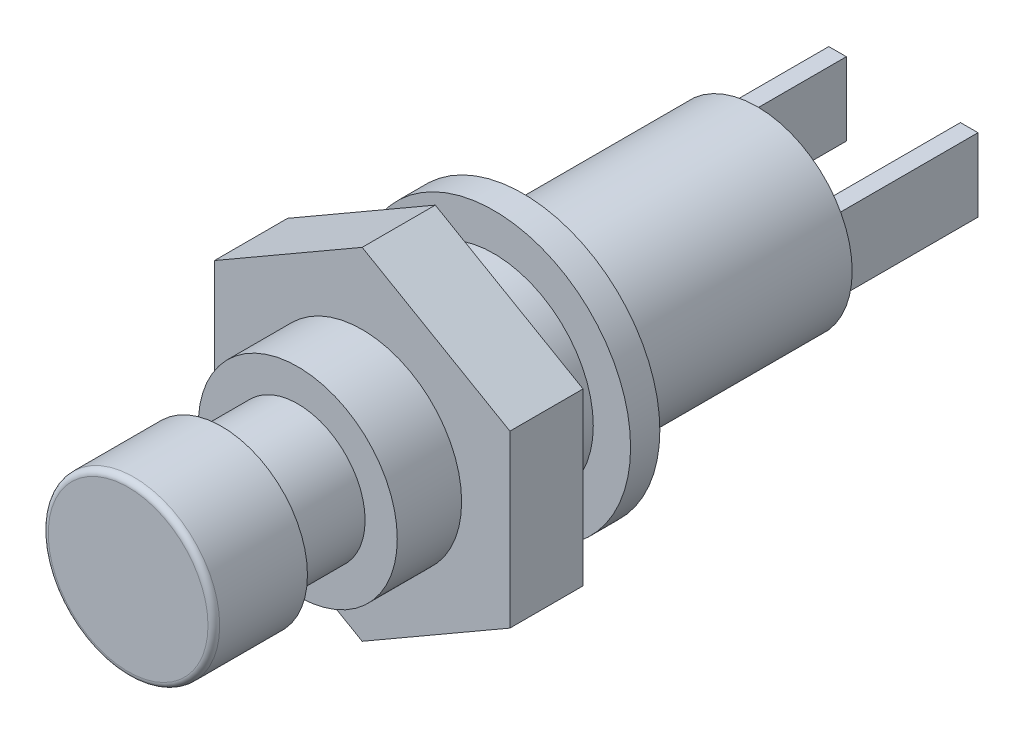
ISO-10303-21;
HEADER;
FILE_DESCRIPTION(('STEP AP214'),'2;1');
FILE_NAME('part.step','',(''),(''),'','','');
FILE_SCHEMA(('AUTOMOTIVE_DESIGN { 1 0 10303 214 1 1 1 1 }'));
ENDSEC;
DATA;
#1=APPLICATION_CONTEXT('core data for automotive mechanical design processes');
#2=APPLICATION_PROTOCOL_DEFINITION('international standard','automotive_design',2000,#1);
#3=PRODUCT_CONTEXT('',#1,'mechanical');
#4=PRODUCT('Part','Part','',(#3));
#5=PRODUCT_RELATED_PRODUCT_CATEGORY('part','',(#4));
#6=PRODUCT_DEFINITION_FORMATION('','',#4);
#7=PRODUCT_DEFINITION_CONTEXT('part definition',#1,'design');
#8=PRODUCT_DEFINITION('design','',#6,#7);
#9=PRODUCT_DEFINITION_SHAPE('','',#8);
#10=(LENGTH_UNIT() NAMED_UNIT(*) SI_UNIT(.MILLI.,.METRE.));
#11=(NAMED_UNIT(*) PLANE_ANGLE_UNIT() SI_UNIT($,.RADIAN.));
#12=(NAMED_UNIT(*) SI_UNIT($,.STERADIAN.) SOLID_ANGLE_UNIT());
#13=UNCERTAINTY_MEASURE_WITH_UNIT(LENGTH_MEASURE(1.E-05),#10,'distance_accuracy_value','');
#14=(GEOMETRIC_REPRESENTATION_CONTEXT(3) GLOBAL_UNCERTAINTY_ASSIGNED_CONTEXT((#13)) GLOBAL_UNIT_ASSIGNED_CONTEXT((#10,
#11,#12)) REPRESENTATION_CONTEXT('',''));
#15=CARTESIAN_POINT('',(0.,0.,0.));
#16=DIRECTION('',(0.,0.,1.));
#17=DIRECTION('',(1.,0.,0.));
#18=AXIS2_PLACEMENT_3D('',#15,#16,#17);
#19=CARTESIAN_POINT('',(0.,0.,6.7));
#20=DIRECTION('',(0.,0.,-1.));
#21=DIRECTION('',(-1.,0.,0.));
#22=AXIS2_PLACEMENT_3D('',#19,#20,#21);
#23=CYLINDRICAL_SURFACE('',#22,3.4);
#24=CARTESIAN_POINT('',(0.,0.,0.));
#25=DIRECTION('',(0.,0.,1.));
#26=DIRECTION('',(1.,0.,0.));
#27=AXIS2_PLACEMENT_3D('',#24,#25,#26);
#28=CIRCLE('',#27,3.4);
#29=CARTESIAN_POINT('',(3.4,0.,0.));
#30=VERTEX_POINT('',#29);
#31=EDGE_CURVE('E249',#30,#30,#28,.T.);
#32=ORIENTED_EDGE('',*,*,#31,.T.);
#33=EDGE_LOOP('',(#32));
#34=FACE_BOUND('',#33,.T.);
#35=CARTESIAN_POINT('',(0.,0.,2.));
#36=DIRECTION('',(0.,0.,1.));
#37=DIRECTION('',(1.,0.,0.));
#38=AXIS2_PLACEMENT_3D('',#35,#36,#37);
#39=CIRCLE('',#38,3.4);
#40=CARTESIAN_POINT('',(3.4,0.,2.));
#41=VERTEX_POINT('',#40);
#42=EDGE_CURVE('E11',#41,#41,#39,.T.);
#43=ORIENTED_EDGE('',*,*,#42,.F.);
#44=EDGE_LOOP('',(#43));
#45=FACE_BOUND('',#44,.T.);
#46=ADVANCED_FACE('F43',(#34,#45),#23,.T.);
#47=CARTESIAN_POINT('',(0.,0.,-9.));
#48=DIRECTION('',(0.,0.,1.));
#49=DIRECTION('',(1.,0.,0.));
#50=AXIS2_PLACEMENT_3D('',#47,#48,#49);
#51=PLANE('',#50);
#52=DIRECTION('',(0.,1.,0.));
#53=VECTOR('',#52,1.);
#54=CARTESIAN_POINT('',(-2.55,-1.25,-9.));
#55=LINE('',#54,#53);
#56=CARTESIAN_POINT('',(-2.55,-1.25,-9.));
#57=VERTEX_POINT('',#56);
#58=CARTESIAN_POINT('',(-2.55,1.25,-9.));
#59=VERTEX_POINT('',#58);
#60=EDGE_CURVE('E186',#57,#59,#55,.T.);
#61=ORIENTED_EDGE('',*,*,#60,.F.);
#62=DIRECTION('',(-1.,0.,0.));
#63=VECTOR('',#62,1.);
#64=CARTESIAN_POINT('',(-1.95,-1.25,-9.));
#65=LINE('',#64,#63);
#66=CARTESIAN_POINT('',(-1.95,-1.25,-9.));
#67=VERTEX_POINT('',#66);
#68=EDGE_CURVE('E216',#67,#57,#65,.T.);
#69=ORIENTED_EDGE('',*,*,#68,.F.);
#70=DIRECTION('',(0.,-1.,0.));
#71=VECTOR('',#70,1.);
#72=CARTESIAN_POINT('',(-1.95,-1.25,-9.));
#73=LINE('',#72,#71);
#74=CARTESIAN_POINT('',(-1.95,1.25,-9.));
#75=VERTEX_POINT('',#74);
#76=EDGE_CURVE('E217',#75,#67,#73,.T.);
#77=ORIENTED_EDGE('',*,*,#76,.F.);
#78=DIRECTION('',(1.,0.,0.));
#79=VECTOR('',#78,1.);
#80=CARTESIAN_POINT('',(-1.95,1.25,-9.));
#81=LINE('',#80,#79);
#82=EDGE_CURVE('E222',#59,#75,#81,.T.);
#83=ORIENTED_EDGE('',*,*,#82,.F.);
#84=EDGE_LOOP('',(#61,#69,#77,#83));
#85=FACE_BOUND('',#84,.T.);
#86=CARTESIAN_POINT('',(0.,0.,-9.));
#87=DIRECTION('',(0.,0.,1.));
#88=DIRECTION('',(1.,0.,0.));
#89=AXIS2_PLACEMENT_3D('',#86,#87,#88);
#90=CIRCLE('',#89,3.25);
#91=CARTESIAN_POINT('',(3.25,0.,-9.));
#92=VERTEX_POINT('',#91);
#93=EDGE_CURVE('E202',#92,#92,#90,.T.);
#94=ORIENTED_EDGE('',*,*,#93,.F.);
#95=EDGE_LOOP('',(#94));
#96=FACE_BOUND('',#95,.T.);
#97=DIRECTION('',(0.,-1.,0.));
#98=VECTOR('',#97,1.);
#99=CARTESIAN_POINT('',(2.55,1.25,-9.));
#100=LINE('',#99,#98);
#101=CARTESIAN_POINT('',(2.55,1.25,-9.));
#102=VERTEX_POINT('',#101);
#103=CARTESIAN_POINT('',(2.55,-1.25,-9.));
#104=VERTEX_POINT('',#103);
#105=EDGE_CURVE('E187',#102,#104,#100,.T.);
#106=ORIENTED_EDGE('',*,*,#105,.F.);
#107=DIRECTION('',(1.,0.,0.));
#108=VECTOR('',#107,1.);
#109=CARTESIAN_POINT('',(1.95,1.25,-9.));
#110=LINE('',#109,#108);
#111=CARTESIAN_POINT('',(1.95,1.25,-9.));
#112=VERTEX_POINT('',#111);
#113=EDGE_CURVE('E177',#112,#102,#110,.T.);
#114=ORIENTED_EDGE('',*,*,#113,.F.);
#115=DIRECTION('',(0.,1.,0.));
#116=VECTOR('',#115,1.);
#117=CARTESIAN_POINT('',(1.95,1.25,-9.));
#118=LINE('',#117,#116);
#119=CARTESIAN_POINT('',(1.95,-1.25,-9.));
#120=VERTEX_POINT('',#119);
#121=EDGE_CURVE('E61',#120,#112,#118,.T.);
#122=ORIENTED_EDGE('',*,*,#121,.F.);
#123=DIRECTION('',(-1.,0.,0.));
#124=VECTOR('',#123,1.);
#125=CARTESIAN_POINT('',(1.95,-1.25,-9.));
#126=LINE('',#125,#124);
#127=EDGE_CURVE('E56',#104,#120,#126,.T.);
#128=ORIENTED_EDGE('',*,*,#127,.F.);
#129=EDGE_LOOP('',(#106,#114,#122,#128));
#130=FACE_BOUND('',#129,.T.);
#131=ADVANCED_FACE('F293',(#85,#96,#130),#51,.F.);
#132=CARTESIAN_POINT('',(0.,0.,-1.));
#133=DIRECTION('',(0.,0.,1.));
#134=DIRECTION('',(1.,0.,0.));
#135=AXIS2_PLACEMENT_3D('',#132,#133,#134);
#136=CYLINDRICAL_SURFACE('',#135,4.675);
#137=CARTESIAN_POINT('',(0.,0.,-1.));
#138=DIRECTION('',(0.,0.,1.));
#139=DIRECTION('',(1.,0.,0.));
#140=AXIS2_PLACEMENT_3D('',#137,#138,#139);
#141=CIRCLE('',#140,4.675);
#142=CARTESIAN_POINT('',(4.675,0.,-1.));
#143=VERTEX_POINT('',#142);
#144=EDGE_CURVE('E257',#143,#143,#141,.T.);
#145=ORIENTED_EDGE('',*,*,#144,.T.);
#146=EDGE_LOOP('',(#145));
#147=FACE_BOUND('',#146,.T.);
#148=CARTESIAN_POINT('',(0.,0.,0.));
#149=DIRECTION('',(0.,0.,1.));
#150=DIRECTION('',(1.,0.,0.));
#151=AXIS2_PLACEMENT_3D('',#148,#149,#150);
#152=CIRCLE('',#151,4.675);
#153=CARTESIAN_POINT('',(4.675,0.,0.));
#154=VERTEX_POINT('',#153);
#155=EDGE_CURVE('E254',#154,#154,#152,.T.);
#156=ORIENTED_EDGE('',*,*,#155,.F.);
#157=EDGE_LOOP('',(#156));
#158=FACE_BOUND('',#157,.T.);
#159=ADVANCED_FACE('F296',(#147,#158),#136,.T.);
#160=CARTESIAN_POINT('',(0.,0.,-1.));
#161=DIRECTION('',(0.,0.,1.));
#162=DIRECTION('',(1.,0.,0.));
#163=AXIS2_PLACEMENT_3D('',#160,#161,#162);
#164=PLANE('',#163);
#165=CARTESIAN_POINT('',(0.,0.,-0.999999999999999));
#166=DIRECTION('',(0.,0.,1.));
#167=DIRECTION('',(1.,0.,0.));
#168=AXIS2_PLACEMENT_3D('',#165,#166,#167);
#169=CIRCLE('',#168,3.25);
#170=CARTESIAN_POINT('',(3.25,0.,-0.999999999999999));
#171=VERTEX_POINT('',#170);
#172=EDGE_CURVE('E238',#171,#171,#169,.T.);
#173=ORIENTED_EDGE('',*,*,#172,.T.);
#174=EDGE_LOOP('',(#173));
#175=FACE_BOUND('',#174,.T.);
#176=ORIENTED_EDGE('',*,*,#144,.F.);
#177=EDGE_LOOP('',(#176));
#178=FACE_BOUND('',#177,.T.);
#179=ADVANCED_FACE('F266',(#175,#178),#164,.F.);
#180=CARTESIAN_POINT('',(0.,0.,0.));
#181=DIRECTION('',(0.,0.,1.));
#182=DIRECTION('',(1.,0.,0.));
#183=AXIS2_PLACEMENT_3D('',#180,#181,#182);
#184=PLANE('',#183);
#185=ORIENTED_EDGE('',*,*,#31,.F.);
#186=EDGE_LOOP('',(#185));
#187=FACE_BOUND('',#186,.T.);
#188=ORIENTED_EDGE('',*,*,#155,.T.);
#189=EDGE_LOOP('',(#188));
#190=FACE_BOUND('',#189,.T.);
#191=ADVANCED_FACE('F274',(#187,#190),#184,.T.);
#192=CARTESIAN_POINT('',(0.,0.,-9.));
#193=DIRECTION('',(0.,0.,1.));
#194=DIRECTION('',(1.,0.,0.));
#195=AXIS2_PLACEMENT_3D('',#192,#193,#194);
#196=CYLINDRICAL_SURFACE('',#195,3.25);
#197=ORIENTED_EDGE('',*,*,#93,.T.);
#198=EDGE_LOOP('',(#197));
#199=FACE_BOUND('',#198,.T.);
#200=ORIENTED_EDGE('',*,*,#172,.F.);
#201=EDGE_LOOP('',(#200));
#202=FACE_BOUND('',#201,.T.);
#203=ADVANCED_FACE('F272',(#199,#202),#196,.T.);
#204=CARTESIAN_POINT('',(-2.55,-1.25,-14.));
#205=DIRECTION('',(1.,0.,0.));
#206=DIRECTION('',(0.,1.,0.));
#207=AXIS2_PLACEMENT_3D('',#204,#205,#206);
#208=PLANE('',#207);
#209=ORIENTED_EDGE('',*,*,#60,.T.);
#210=DIRECTION('',(0.,0.,1.));
#211=VECTOR('',#210,1.);
#212=CARTESIAN_POINT('',(-2.55,1.25,-14.));
#213=LINE('',#212,#211);
#214=CARTESIAN_POINT('',(-2.55,1.25,-14.));
#215=VERTEX_POINT('',#214);
#216=EDGE_CURVE('E167',#215,#59,#213,.T.);
#217=ORIENTED_EDGE('',*,*,#216,.F.);
#218=DIRECTION('',(0.,1.,0.));
#219=VECTOR('',#218,1.);
#220=CARTESIAN_POINT('',(-2.55,-1.25,-14.));
#221=LINE('',#220,#219);
#222=CARTESIAN_POINT('',(-2.55,-1.25,-14.));
#223=VERTEX_POINT('',#222);
#224=EDGE_CURVE('E223',#223,#215,#221,.T.);
#225=ORIENTED_EDGE('',*,*,#224,.F.);
#226=DIRECTION('',(0.,0.,1.));
#227=VECTOR('',#226,1.);
#228=CARTESIAN_POINT('',(-2.55,-1.25,-14.));
#229=LINE('',#228,#227);
#230=EDGE_CURVE('E214',#223,#57,#229,.T.);
#231=ORIENTED_EDGE('',*,*,#230,.T.);
#232=EDGE_LOOP('',(#209,#217,#225,#231));
#233=FACE_BOUND('',#232,.T.);
#234=ADVANCED_FACE('F271',(#233),#208,.F.);
#235=CARTESIAN_POINT('',(-1.95,1.25,-14.));
#236=DIRECTION('',(0.,-1.,0.));
#237=DIRECTION('',(0.,0.,-1.));
#238=AXIS2_PLACEMENT_3D('',#235,#236,#237);
#239=PLANE('',#238);
#240=ORIENTED_EDGE('',*,*,#82,.T.);
#241=DIRECTION('',(0.,0.,1.));
#242=VECTOR('',#241,1.);
#243=CARTESIAN_POINT('',(-1.95,1.25,-14.));
#244=LINE('',#243,#242);
#245=CARTESIAN_POINT('',(-1.95,1.25,-14.));
#246=VERTEX_POINT('',#245);
#247=EDGE_CURVE('E210',#246,#75,#244,.T.);
#248=ORIENTED_EDGE('',*,*,#247,.F.);
#249=DIRECTION('',(1.,0.,0.));
#250=VECTOR('',#249,1.);
#251=CARTESIAN_POINT('',(-1.95,1.25,-14.));
#252=LINE('',#251,#250);
#253=EDGE_CURVE('E235',#215,#246,#252,.T.);
#254=ORIENTED_EDGE('',*,*,#253,.F.);
#255=ORIENTED_EDGE('',*,*,#216,.T.);
#256=EDGE_LOOP('',(#240,#248,#254,#255));
#257=FACE_BOUND('',#256,.T.);
#258=ADVANCED_FACE('F281',(#257),#239,.F.);
#259=CARTESIAN_POINT('',(-1.95,-1.25,-14.));
#260=DIRECTION('',(-1.,0.,0.));
#261=DIRECTION('',(0.,0.,1.));
#262=AXIS2_PLACEMENT_3D('',#259,#260,#261);
#263=PLANE('',#262);
#264=ORIENTED_EDGE('',*,*,#76,.T.);
#265=DIRECTION('',(0.,0.,1.));
#266=VECTOR('',#265,1.);
#267=CARTESIAN_POINT('',(-1.95,-1.25,-14.));
#268=LINE('',#267,#266);
#269=CARTESIAN_POINT('',(-1.95,-1.25,-14.));
#270=VERTEX_POINT('',#269);
#271=EDGE_CURVE('E208',#270,#67,#268,.T.);
#272=ORIENTED_EDGE('',*,*,#271,.F.);
#273=DIRECTION('',(0.,-1.,0.));
#274=VECTOR('',#273,1.);
#275=CARTESIAN_POINT('',(-1.95,-1.25,-14.));
#276=LINE('',#275,#274);
#277=EDGE_CURVE('E229',#246,#270,#276,.T.);
#278=ORIENTED_EDGE('',*,*,#277,.F.);
#279=ORIENTED_EDGE('',*,*,#247,.T.);
#280=EDGE_LOOP('',(#264,#272,#278,#279));
#281=FACE_BOUND('',#280,.T.);
#282=ADVANCED_FACE('F367',(#281),#263,.F.);
#283=CARTESIAN_POINT('',(-1.95,-1.25,-14.));
#284=DIRECTION('',(0.,1.,0.));
#285=DIRECTION('',(0.,0.,1.));
#286=AXIS2_PLACEMENT_3D('',#283,#284,#285);
#287=PLANE('',#286);
#288=ORIENTED_EDGE('',*,*,#68,.T.);
#289=ORIENTED_EDGE('',*,*,#230,.F.);
#290=DIRECTION('',(-1.,0.,0.));
#291=VECTOR('',#290,1.);
#292=CARTESIAN_POINT('',(-1.95,-1.25,-14.));
#293=LINE('',#292,#291);
#294=EDGE_CURVE('E219',#270,#223,#293,.T.);
#295=ORIENTED_EDGE('',*,*,#294,.F.);
#296=ORIENTED_EDGE('',*,*,#271,.T.);
#297=EDGE_LOOP('',(#288,#289,#295,#296));
#298=FACE_BOUND('',#297,.T.);
#299=ADVANCED_FACE('F373',(#298),#287,.F.);
#300=CARTESIAN_POINT('',(0.,0.,-14.));
#301=DIRECTION('',(0.,0.,1.));
#302=DIRECTION('',(1.,0.,0.));
#303=AXIS2_PLACEMENT_3D('',#300,#301,#302);
#304=PLANE('',#303);
#305=ORIENTED_EDGE('',*,*,#224,.T.);
#306=ORIENTED_EDGE('',*,*,#253,.T.);
#307=ORIENTED_EDGE('',*,*,#277,.T.);
#308=ORIENTED_EDGE('',*,*,#294,.T.);
#309=EDGE_LOOP('',(#305,#306,#307,#308));
#310=FACE_BOUND('',#309,.T.);
#311=ADVANCED_FACE('F364',(#310),#304,.F.);
#312=CARTESIAN_POINT('',(2.55,1.25,-14.));
#313=DIRECTION('',(-1.,0.,0.));
#314=DIRECTION('',(0.,-1.,0.));
#315=AXIS2_PLACEMENT_3D('',#312,#313,#314);
#316=PLANE('',#315);
#317=ORIENTED_EDGE('',*,*,#105,.T.);
#318=DIRECTION('',(0.,0.,1.));
#319=VECTOR('',#318,1.);
#320=CARTESIAN_POINT('',(2.55,-1.25,-14.));
#321=LINE('',#320,#319);
#322=CARTESIAN_POINT('',(2.55,-1.25,-14.));
#323=VERTEX_POINT('',#322);
#324=EDGE_CURVE('E205',#323,#104,#321,.T.);
#325=ORIENTED_EDGE('',*,*,#324,.F.);
#326=DIRECTION('',(0.,-1.,0.));
#327=VECTOR('',#326,1.);
#328=CARTESIAN_POINT('',(2.55,1.25,-14.));
#329=LINE('',#328,#327);
#330=CARTESIAN_POINT('',(2.55,1.25,-14.));
#331=VERTEX_POINT('',#330);
#332=EDGE_CURVE('E174',#331,#323,#329,.T.);
#333=ORIENTED_EDGE('',*,*,#332,.F.);
#334=DIRECTION('',(0.,0.,1.));
#335=VECTOR('',#334,1.);
#336=CARTESIAN_POINT('',(2.55,1.25,-14.));
#337=LINE('',#336,#335);
#338=EDGE_CURVE('E184',#331,#102,#337,.T.);
#339=ORIENTED_EDGE('',*,*,#338,.T.);
#340=EDGE_LOOP('',(#317,#325,#333,#339));
#341=FACE_BOUND('',#340,.T.);
#342=ADVANCED_FACE('F363',(#341),#316,.F.);
#343=CARTESIAN_POINT('',(1.95,-1.25,-14.));
#344=DIRECTION('',(0.,1.,0.));
#345=DIRECTION('',(-1.,0.,0.));
#346=AXIS2_PLACEMENT_3D('',#343,#344,#345);
#347=PLANE('',#346);
#348=ORIENTED_EDGE('',*,*,#127,.T.);
#349=DIRECTION('',(0.,0.,1.));
#350=VECTOR('',#349,1.);
#351=CARTESIAN_POINT('',(1.95,-1.25,-14.));
#352=LINE('',#351,#350);
#353=CARTESIAN_POINT('',(1.95,-1.25,-14.));
#354=VERTEX_POINT('',#353);
#355=EDGE_CURVE('E198',#354,#120,#352,.T.);
#356=ORIENTED_EDGE('',*,*,#355,.F.);
#357=DIRECTION('',(-1.,0.,0.));
#358=VECTOR('',#357,1.);
#359=CARTESIAN_POINT('',(1.95,-1.25,-14.));
#360=LINE('',#359,#358);
#361=EDGE_CURVE('E178',#323,#354,#360,.T.);
#362=ORIENTED_EDGE('',*,*,#361,.F.);
#363=ORIENTED_EDGE('',*,*,#324,.T.);
#364=EDGE_LOOP('',(#348,#356,#362,#363));
#365=FACE_BOUND('',#364,.T.);
#366=ADVANCED_FACE('F357',(#365),#347,.F.);
#367=CARTESIAN_POINT('',(1.95,1.25,-14.));
#368=DIRECTION('',(1.,0.,0.));
#369=DIRECTION('',(0.,1.,0.));
#370=AXIS2_PLACEMENT_3D('',#367,#368,#369);
#371=PLANE('',#370);
#372=ORIENTED_EDGE('',*,*,#121,.T.);
#373=DIRECTION('',(0.,0.,1.));
#374=VECTOR('',#373,1.);
#375=CARTESIAN_POINT('',(1.95,1.25,-14.));
#376=LINE('',#375,#374);
#377=CARTESIAN_POINT('',(1.95,1.25,-14.));
#378=VERTEX_POINT('',#377);
#379=EDGE_CURVE('E199',#378,#112,#376,.T.);
#380=ORIENTED_EDGE('',*,*,#379,.F.);
#381=DIRECTION('',(0.,1.,0.));
#382=VECTOR('',#381,1.);
#383=CARTESIAN_POINT('',(1.95,1.25,-14.));
#384=LINE('',#383,#382);
#385=EDGE_CURVE('E181',#354,#378,#384,.T.);
#386=ORIENTED_EDGE('',*,*,#385,.F.);
#387=ORIENTED_EDGE('',*,*,#355,.T.);
#388=EDGE_LOOP('',(#372,#380,#386,#387));
#389=FACE_BOUND('',#388,.T.);
#390=ADVANCED_FACE('F351',(#389),#371,.F.);
#391=CARTESIAN_POINT('',(1.95,1.25,-14.));
#392=DIRECTION('',(0.,-1.,0.));
#393=DIRECTION('',(0.,0.,-1.));
#394=AXIS2_PLACEMENT_3D('',#391,#392,#393);
#395=PLANE('',#394);
#396=ORIENTED_EDGE('',*,*,#113,.T.);
#397=ORIENTED_EDGE('',*,*,#338,.F.);
#398=DIRECTION('',(1.,0.,0.));
#399=VECTOR('',#398,1.);
#400=CARTESIAN_POINT('',(1.95,1.25,-14.));
#401=LINE('',#400,#399);
#402=EDGE_CURVE('E182',#378,#331,#401,.T.);
#403=ORIENTED_EDGE('',*,*,#402,.F.);
#404=ORIENTED_EDGE('',*,*,#379,.T.);
#405=EDGE_LOOP('',(#396,#397,#403,#404));
#406=FACE_BOUND('',#405,.T.);
#407=ADVANCED_FACE('F348',(#406),#395,.F.);
#408=CARTESIAN_POINT('',(0.,0.,-14.));
#409=DIRECTION('',(0.,0.,1.));
#410=DIRECTION('',(1.,0.,0.));
#411=AXIS2_PLACEMENT_3D('',#408,#409,#410);
#412=PLANE('',#411);
#413=ORIENTED_EDGE('',*,*,#332,.T.);
#414=ORIENTED_EDGE('',*,*,#361,.T.);
#415=ORIENTED_EDGE('',*,*,#385,.T.);
#416=ORIENTED_EDGE('',*,*,#402,.T.);
#417=EDGE_LOOP('',(#413,#414,#415,#416));
#418=FACE_BOUND('',#417,.T.);
#419=ADVANCED_FACE('F349',(#418),#412,.F.);
#420=CARTESIAN_POINT('',(5.05,2.91561885940761,4.5));
#421=DIRECTION('',(-0.5,-0.866025403784439,0.));
#422=DIRECTION('',(0.866025403784439,-0.5,0.));
#423=AXIS2_PLACEMENT_3D('',#420,#421,#422);
#424=PLANE('',#423);
#425=DIRECTION('',(-0.866025403784439,0.5,0.));
#426=VECTOR('',#425,1.);
#427=CARTESIAN_POINT('',(5.05,2.91561885940761,2.));
#428=LINE('',#427,#426);
#429=CARTESIAN_POINT('',(5.05,2.91561885940761,2.));
#430=VERTEX_POINT('',#429);
#431=CARTESIAN_POINT('',(0.,5.83123771881522,2.));
#432=VERTEX_POINT('',#431);
#433=EDGE_CURVE('E170',#430,#432,#428,.T.);
#434=ORIENTED_EDGE('',*,*,#433,.T.);
#435=DIRECTION('',(0.,0.,-1.));
#436=VECTOR('',#435,1.);
#437=CARTESIAN_POINT('',(0.,5.83123771881522,4.5));
#438=LINE('',#437,#436);
#439=CARTESIAN_POINT('',(0.,5.83123771881522,4.5));
#440=VERTEX_POINT('',#439);
#441=EDGE_CURVE('E150',#440,#432,#438,.T.);
#442=ORIENTED_EDGE('',*,*,#441,.F.);
#443=DIRECTION('',(-0.866025403784439,0.5,0.));
#444=VECTOR('',#443,1.);
#445=CARTESIAN_POINT('',(5.05,2.91561885940761,4.5));
#446=LINE('',#445,#444);
#447=CARTESIAN_POINT('',(5.05,2.91561885940761,4.5));
#448=VERTEX_POINT('',#447);
#449=EDGE_CURVE('E153',#448,#440,#446,.T.);
#450=ORIENTED_EDGE('',*,*,#449,.F.);
#451=DIRECTION('',(0.,0.,-1.));
#452=VECTOR('',#451,1.);
#453=CARTESIAN_POINT('',(5.05,2.91561885940761,4.5));
#454=LINE('',#453,#452);
#455=EDGE_CURVE('E724',#448,#430,#454,.T.);
#456=ORIENTED_EDGE('',*,*,#455,.T.);
#457=EDGE_LOOP('',(#434,#442,#450,#456));
#458=FACE_BOUND('',#457,.T.);
#459=ADVANCED_FACE('F164',(#458),#424,.F.);
#460=CARTESIAN_POINT('',(0.,5.83123771881522,4.5));
#461=DIRECTION('',(0.5,-0.866025403784439,0.));
#462=DIRECTION('',(0.866025403784439,0.5,0.));
#463=AXIS2_PLACEMENT_3D('',#460,#461,#462);
#464=PLANE('',#463);
#465=DIRECTION('',(-0.866025403784439,-0.5,0.));
#466=VECTOR('',#465,1.);
#467=CARTESIAN_POINT('',(0.,5.83123771881522,2.));
#468=LINE('',#467,#466);
#469=CARTESIAN_POINT('',(-5.05,2.91561885940761,2.));
#470=VERTEX_POINT('',#469);
#471=EDGE_CURVE('E712',#432,#470,#468,.T.);
#472=ORIENTED_EDGE('',*,*,#471,.T.);
#473=DIRECTION('',(0.,0.,-1.));
#474=VECTOR('',#473,1.);
#475=CARTESIAN_POINT('',(-5.05,2.91561885940761,4.5));
#476=LINE('',#475,#474);
#477=CARTESIAN_POINT('',(-5.05,2.91561885940761,4.5));
#478=VERTEX_POINT('',#477);
#479=EDGE_CURVE('E148',#478,#470,#476,.T.);
#480=ORIENTED_EDGE('',*,*,#479,.F.);
#481=DIRECTION('',(-0.866025403784439,-0.5,0.));
#482=VECTOR('',#481,1.);
#483=CARTESIAN_POINT('',(0.,5.83123771881522,4.5));
#484=LINE('',#483,#482);
#485=EDGE_CURVE('E141',#440,#478,#484,.T.);
#486=ORIENTED_EDGE('',*,*,#485,.F.);
#487=ORIENTED_EDGE('',*,*,#441,.T.);
#488=EDGE_LOOP('',(#472,#480,#486,#487));
#489=FACE_BOUND('',#488,.T.);
#490=ADVANCED_FACE('F143',(#489),#464,.F.);
#491=CARTESIAN_POINT('',(-5.05,2.91561885940761,4.5));
#492=DIRECTION('',(1.,0.,0.));
#493=DIRECTION('',(0.,1.,0.));
#494=AXIS2_PLACEMENT_3D('',#491,#492,#493);
#495=PLANE('',#494);
#496=DIRECTION('',(0.,-1.,0.));
#497=VECTOR('',#496,1.);
#498=CARTESIAN_POINT('',(-5.05,2.91561885940761,2.));
#499=LINE('',#498,#497);
#500=CARTESIAN_POINT('',(-5.05,-2.91561885940761,2.));
#501=VERTEX_POINT('',#500);
#502=EDGE_CURVE('E704',#470,#501,#499,.T.);
#503=ORIENTED_EDGE('',*,*,#502,.T.);
#504=DIRECTION('',(0.,0.,-1.));
#505=VECTOR('',#504,1.);
#506=CARTESIAN_POINT('',(-5.05,-2.91561885940761,4.5));
#507=LINE('',#506,#505);
#508=CARTESIAN_POINT('',(-5.05,-2.91561885940761,4.5));
#509=VERTEX_POINT('',#508);
#510=EDGE_CURVE('E171',#509,#501,#507,.T.);
#511=ORIENTED_EDGE('',*,*,#510,.F.);
#512=DIRECTION('',(0.,-1.,0.));
#513=VECTOR('',#512,1.);
#514=CARTESIAN_POINT('',(-5.05,2.91561885940761,4.5));
#515=LINE('',#514,#513);
#516=EDGE_CURVE('E155',#478,#509,#515,.T.);
#517=ORIENTED_EDGE('',*,*,#516,.F.);
#518=ORIENTED_EDGE('',*,*,#479,.T.);
#519=EDGE_LOOP('',(#503,#511,#517,#518));
#520=FACE_BOUND('',#519,.T.);
#521=ADVANCED_FACE('F340',(#520),#495,.F.);
#522=CARTESIAN_POINT('',(-5.05,-2.91561885940761,4.5));
#523=DIRECTION('',(0.5,0.866025403784439,0.));
#524=DIRECTION('',(-0.866025403784439,0.5,0.));
#525=AXIS2_PLACEMENT_3D('',#522,#523,#524);
#526=PLANE('',#525);
#527=DIRECTION('',(0.866025403784439,-0.5,0.));
#528=VECTOR('',#527,1.);
#529=CARTESIAN_POINT('',(-5.05,-2.91561885940761,2.));
#530=LINE('',#529,#528);
#531=CARTESIAN_POINT('',(0.,-5.83123771881522,2.));
#532=VERTEX_POINT('',#531);
#533=EDGE_CURVE('E708',#501,#532,#530,.T.);
#534=ORIENTED_EDGE('',*,*,#533,.T.);
#535=DIRECTION('',(0.,0.,-1.));
#536=VECTOR('',#535,1.);
#537=CARTESIAN_POINT('',(0.,-5.83123771881522,4.5));
#538=LINE('',#537,#536);
#539=CARTESIAN_POINT('',(0.,-5.83123771881522,4.5));
#540=VERTEX_POINT('',#539);
#541=EDGE_CURVE('E719',#540,#532,#538,.T.);
#542=ORIENTED_EDGE('',*,*,#541,.F.);
#543=DIRECTION('',(0.866025403784439,-0.5,0.));
#544=VECTOR('',#543,1.);
#545=CARTESIAN_POINT('',(-5.05,-2.91561885940761,4.5));
#546=LINE('',#545,#544);
#547=EDGE_CURVE('E713',#509,#540,#546,.T.);
#548=ORIENTED_EDGE('',*,*,#547,.F.);
#549=ORIENTED_EDGE('',*,*,#510,.T.);
#550=EDGE_LOOP('',(#534,#542,#548,#549));
#551=FACE_BOUND('',#550,.T.);
#552=ADVANCED_FACE('F331',(#551),#526,.F.);
#553=CARTESIAN_POINT('',(0.,-5.83123771881522,4.5));
#554=DIRECTION('',(-0.5,0.866025403784439,0.));
#555=DIRECTION('',(-0.866025403784439,-0.5,0.));
#556=AXIS2_PLACEMENT_3D('',#553,#554,#555);
#557=PLANE('',#556);
#558=DIRECTION('',(0.866025403784439,0.5,0.));
#559=VECTOR('',#558,1.);
#560=CARTESIAN_POINT('',(0.,-5.83123771881522,2.));
#561=LINE('',#560,#559);
#562=CARTESIAN_POINT('',(5.05,-2.91561885940761,2.));
#563=VERTEX_POINT('',#562);
#564=EDGE_CURVE('E718',#532,#563,#561,.T.);
#565=ORIENTED_EDGE('',*,*,#564,.T.);
#566=DIRECTION('',(0.,0.,-1.));
#567=VECTOR('',#566,1.);
#568=CARTESIAN_POINT('',(5.05,-2.91561885940761,4.5));
#569=LINE('',#568,#567);
#570=CARTESIAN_POINT('',(5.05,-2.91561885940761,4.5));
#571=VERTEX_POINT('',#570);
#572=EDGE_CURVE('E730',#571,#563,#569,.T.);
#573=ORIENTED_EDGE('',*,*,#572,.F.);
#574=DIRECTION('',(0.866025403784439,0.5,0.));
#575=VECTOR('',#574,1.);
#576=CARTESIAN_POINT('',(0.,-5.83123771881522,4.5));
#577=LINE('',#576,#575);
#578=EDGE_CURVE('E735',#540,#571,#577,.T.);
#579=ORIENTED_EDGE('',*,*,#578,.F.);
#580=ORIENTED_EDGE('',*,*,#541,.T.);
#581=EDGE_LOOP('',(#565,#573,#579,#580));
#582=FACE_BOUND('',#581,.T.);
#583=ADVANCED_FACE('F326',(#582),#557,.F.);
#584=CARTESIAN_POINT('',(5.05,-2.91561885940761,4.5));
#585=DIRECTION('',(-1.,0.,0.));
#586=DIRECTION('',(0.,-1.,0.));
#587=AXIS2_PLACEMENT_3D('',#584,#585,#586);
#588=PLANE('',#587);
#589=DIRECTION('',(0.,1.,0.));
#590=VECTOR('',#589,1.);
#591=CARTESIAN_POINT('',(5.05,-2.91561885940761,2.));
#592=LINE('',#591,#590);
#593=EDGE_CURVE('E161',#563,#430,#592,.T.);
#594=ORIENTED_EDGE('',*,*,#593,.T.);
#595=ORIENTED_EDGE('',*,*,#455,.F.);
#596=DIRECTION('',(0.,1.,0.));
#597=VECTOR('',#596,1.);
#598=CARTESIAN_POINT('',(5.05,-2.91561885940761,4.5));
#599=LINE('',#598,#597);
#600=EDGE_CURVE('E157',#571,#448,#599,.T.);
#601=ORIENTED_EDGE('',*,*,#600,.F.);
#602=ORIENTED_EDGE('',*,*,#572,.T.);
#603=EDGE_LOOP('',(#594,#595,#601,#602));
#604=FACE_BOUND('',#603,.T.);
#605=ADVANCED_FACE('F319',(#604),#588,.F.);
#606=CARTESIAN_POINT('',(0.,0.,4.5));
#607=DIRECTION('',(0.,0.,1.));
#608=DIRECTION('',(1.,0.,0.));
#609=AXIS2_PLACEMENT_3D('',#606,#607,#608);
#610=PLANE('',#609);
#611=CARTESIAN_POINT('',(0.,0.,4.5));
#612=DIRECTION('',(0.,0.,1.));
#613=DIRECTION('',(1.,0.,0.));
#614=AXIS2_PLACEMENT_3D('',#611,#612,#613);
#615=CIRCLE('',#614,3.4);
#616=CARTESIAN_POINT('',(3.4,0.,4.5));
#617=VERTEX_POINT('',#616);
#618=EDGE_CURVE('E50',#617,#617,#615,.T.);
#619=ORIENTED_EDGE('',*,*,#618,.F.);
#620=EDGE_LOOP('',(#619));
#621=FACE_BOUND('',#620,.T.);
#622=ORIENTED_EDGE('',*,*,#449,.T.);
#623=ORIENTED_EDGE('',*,*,#485,.T.);
#624=ORIENTED_EDGE('',*,*,#516,.T.);
#625=ORIENTED_EDGE('',*,*,#547,.T.);
#626=ORIENTED_EDGE('',*,*,#578,.T.);
#627=ORIENTED_EDGE('',*,*,#600,.T.);
#628=EDGE_LOOP('',(#622,#623,#624,#625,#626,#627));
#629=FACE_BOUND('',#628,.T.);
#630=ADVANCED_FACE('F160',(#621,#629),#610,.T.);
#631=CARTESIAN_POINT('',(0.,0.,2.));
#632=DIRECTION('',(0.,0.,1.));
#633=DIRECTION('',(1.,0.,0.));
#634=AXIS2_PLACEMENT_3D('',#631,#632,#633);
#635=PLANE('',#634);
#636=ORIENTED_EDGE('',*,*,#42,.T.);
#637=EDGE_LOOP('',(#636));
#638=FACE_BOUND('',#637,.T.);
#639=ORIENTED_EDGE('',*,*,#433,.F.);
#640=ORIENTED_EDGE('',*,*,#593,.F.);
#641=ORIENTED_EDGE('',*,*,#564,.F.);
#642=ORIENTED_EDGE('',*,*,#533,.F.);
#643=ORIENTED_EDGE('',*,*,#502,.F.);
#644=ORIENTED_EDGE('',*,*,#471,.F.);
#645=EDGE_LOOP('',(#639,#640,#641,#642,#643,#644));
#646=FACE_BOUND('',#645,.T.);
#647=ADVANCED_FACE('F320',(#638,#646),#635,.F.);
#648=CARTESIAN_POINT('',(0.,0.,12.5));
#649=DIRECTION('',(0.,0.,1.));
#650=DIRECTION('',(1.,0.,0.));
#651=AXIS2_PLACEMENT_3D('',#648,#649,#650);
#652=PLANE('',#651);
#653=CARTESIAN_POINT('',(0.,0.,12.5));
#654=DIRECTION('',(0.,0.,1.));
#655=DIRECTION('',(1.,0.,0.));
#656=AXIS2_PLACEMENT_3D('',#653,#654,#655);
#657=CIRCLE('',#656,2.73);
#658=CARTESIAN_POINT('',(2.73,0.,12.5));
#659=VERTEX_POINT('',#658);
#660=EDGE_CURVE('E248',#659,#659,#657,.T.);
#661=ORIENTED_EDGE('',*,*,#660,.T.);
#662=EDGE_LOOP('',(#661));
#663=FACE_BOUND('',#662,.T.);
#664=ADVANCED_FACE('F321',(#663),#652,.T.);
#665=CARTESIAN_POINT('',(0.,0.,12.3));
#666=DIRECTION('',(0.,0.,1.));
#667=DIRECTION('',(1.,0.,0.));
#668=AXIS2_PLACEMENT_3D('',#665,#666,#667);
#669=TOROIDAL_SURFACE('',#668,2.73,0.2);
#670=CARTESIAN_POINT('',(0.,0.,12.3));
#671=DIRECTION('',(0.,0.,1.));
#672=DIRECTION('',(1.,0.,0.));
#673=AXIS2_PLACEMENT_3D('',#670,#671,#672);
#674=CIRCLE('',#673,2.93);
#675=CARTESIAN_POINT('',(2.93,0.,12.3));
#676=VERTEX_POINT('',#675);
#677=EDGE_CURVE('E55',#676,#676,#674,.F.);
#678=ORIENTED_EDGE('',*,*,#677,.F.);
#679=EDGE_LOOP('',(#678));
#680=FACE_BOUND('',#679,.T.);
#681=ORIENTED_EDGE('',*,*,#660,.F.);
#682=EDGE_LOOP('',(#681));
#683=FACE_BOUND('',#682,.T.);
#684=ADVANCED_FACE('F44',(#680,#683),#669,.T.);
#685=CARTESIAN_POINT('',(0.,0.,12.5));
#686=DIRECTION('',(0.,0.,-1.));
#687=DIRECTION('',(-1.,0.,0.));
#688=AXIS2_PLACEMENT_3D('',#685,#686,#687);
#689=CYLINDRICAL_SURFACE('',#688,2.93);
#690=ORIENTED_EDGE('',*,*,#677,.T.);
#691=EDGE_LOOP('',(#690));
#692=FACE_BOUND('',#691,.T.);
#693=CARTESIAN_POINT('',(0.,0.,9.3));
#694=DIRECTION('',(0.,0.,1.));
#695=DIRECTION('',(1.,0.,0.));
#696=AXIS2_PLACEMENT_3D('',#693,#694,#695);
#697=CIRCLE('',#696,2.93);
#698=CARTESIAN_POINT('',(2.93,0.,9.3));
#699=VERTEX_POINT('',#698);
#700=EDGE_CURVE('E237',#699,#699,#697,.T.);
#701=ORIENTED_EDGE('',*,*,#700,.T.);
#702=EDGE_LOOP('',(#701));
#703=FACE_BOUND('',#702,.T.);
#704=ADVANCED_FACE('F497',(#692,#703),#689,.T.);
#705=CARTESIAN_POINT('',(0.,0.,9.3));
#706=DIRECTION('',(0.,0.,1.));
#707=DIRECTION('',(1.,0.,0.));
#708=AXIS2_PLACEMENT_3D('',#705,#706,#707);
#709=PLANE('',#708);
#710=CARTESIAN_POINT('',(0.,0.,9.3));
#711=DIRECTION('',(0.,0.,1.));
#712=DIRECTION('',(1.,0.,0.));
#713=AXIS2_PLACEMENT_3D('',#710,#711,#712);
#714=CIRCLE('',#713,2.3);
#715=CARTESIAN_POINT('',(2.3,0.,9.3));
#716=VERTEX_POINT('',#715);
#717=EDGE_CURVE('E245',#716,#716,#714,.T.);
#718=ORIENTED_EDGE('',*,*,#717,.T.);
#719=EDGE_LOOP('',(#718));
#720=FACE_BOUND('',#719,.T.);
#721=ORIENTED_EDGE('',*,*,#700,.F.);
#722=EDGE_LOOP('',(#721));
#723=FACE_BOUND('',#722,.T.);
#724=ADVANCED_FACE('F462',(#720,#723),#709,.F.);
#725=CARTESIAN_POINT('',(0.,0.,9.3));
#726=DIRECTION('',(0.,0.,-1.));
#727=DIRECTION('',(-1.,0.,0.));
#728=AXIS2_PLACEMENT_3D('',#725,#726,#727);
#729=CYLINDRICAL_SURFACE('',#728,2.3);
#730=ORIENTED_EDGE('',*,*,#717,.F.);
#731=EDGE_LOOP('',(#730));
#732=FACE_BOUND('',#731,.T.);
#733=CARTESIAN_POINT('',(0.,0.,6.7));
#734=DIRECTION('',(0.,0.,1.));
#735=DIRECTION('',(1.,0.,0.));
#736=AXIS2_PLACEMENT_3D('',#733,#734,#735);
#737=CIRCLE('',#736,2.3);
#738=CARTESIAN_POINT('',(2.3,0.,6.7));
#739=VERTEX_POINT('',#738);
#740=EDGE_CURVE('E246',#739,#739,#737,.T.);
#741=ORIENTED_EDGE('',*,*,#740,.T.);
#742=EDGE_LOOP('',(#741));
#743=FACE_BOUND('',#742,.T.);
#744=ADVANCED_FACE('F307',(#732,#743),#729,.T.);
#745=CARTESIAN_POINT('',(0.,0.,6.7));
#746=DIRECTION('',(0.,0.,1.));
#747=DIRECTION('',(1.,0.,0.));
#748=AXIS2_PLACEMENT_3D('',#745,#746,#747);
#749=PLANE('',#748);
#750=ORIENTED_EDGE('',*,*,#740,.F.);
#751=EDGE_LOOP('',(#750));
#752=FACE_BOUND('',#751,.T.);
#753=CARTESIAN_POINT('',(0.,0.,6.7));
#754=DIRECTION('',(0.,0.,1.));
#755=DIRECTION('',(1.,0.,0.));
#756=AXIS2_PLACEMENT_3D('',#753,#754,#755);
#757=CIRCLE('',#756,3.4);
#758=CARTESIAN_POINT('',(3.4,0.,6.7));
#759=VERTEX_POINT('',#758);
#760=EDGE_CURVE('E244',#759,#759,#757,.T.);
#761=ORIENTED_EDGE('',*,*,#760,.T.);
#762=EDGE_LOOP('',(#761));
#763=FACE_BOUND('',#762,.T.);
#764=ADVANCED_FACE('F302',(#752,#763),#749,.T.);
#765=ORIENTED_EDGE('',*,*,#618,.T.);
#766=EDGE_LOOP('',(#765));
#767=FACE_BOUND('',#766,.T.);
#768=ORIENTED_EDGE('',*,*,#760,.F.);
#769=EDGE_LOOP('',(#768));
#770=FACE_BOUND('',#769,.T.);
#771=ADVANCED_FACE('F295',(#767,#770),#23,.T.);
#772=CLOSED_SHELL('',(#46,#131,#159,#179,#191,#203,#234,#258,#282,#299,#311,#342,#366,#390,#407,
#419,#459,#490,#521,#552,#583,#605,#630,#647,#664,#684,#704,#724,#744,#764,#771));
#773=MANIFOLD_SOLID_BREP('B2',#772);
#774=ADVANCED_BREP_SHAPE_REPRESENTATION('',(#18,#773),#14);
#775=SHAPE_DEFINITION_REPRESENTATION(#9,#774);
ENDSEC;
END-ISO-10303-21;
